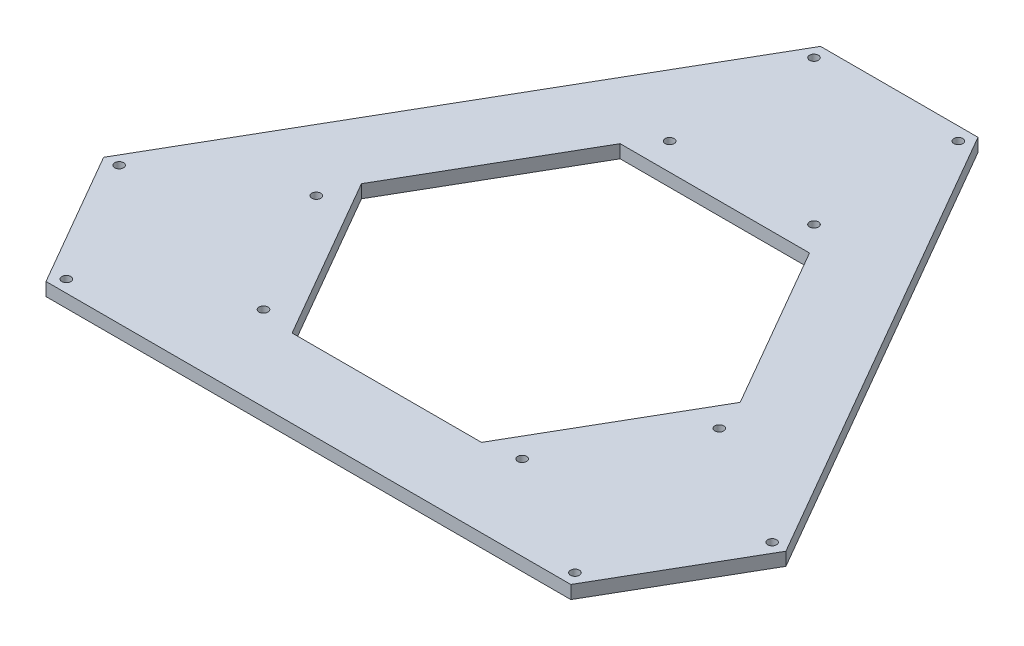
ISO-10303-21;
HEADER;
FILE_DESCRIPTION(('STEP AP214'),'2;1');
FILE_NAME('part.step','',(''),(''),'','','');
FILE_SCHEMA(('AUTOMOTIVE_DESIGN { 1 0 10303 214 1 1 1 1 }'));
ENDSEC;
DATA;
#1=APPLICATION_CONTEXT('core data for automotive mechanical design processes');
#2=APPLICATION_PROTOCOL_DEFINITION('international standard','automotive_design',2000,#1);
#3=PRODUCT_CONTEXT('',#1,'mechanical');
#4=PRODUCT('Part','Part','',(#3));
#5=PRODUCT_RELATED_PRODUCT_CATEGORY('part','',(#4));
#6=PRODUCT_DEFINITION_FORMATION('','',#4);
#7=PRODUCT_DEFINITION_CONTEXT('part definition',#1,'design');
#8=PRODUCT_DEFINITION('design','',#6,#7);
#9=PRODUCT_DEFINITION_SHAPE('','',#8);
#10=(LENGTH_UNIT() NAMED_UNIT(*) SI_UNIT(.MILLI.,.METRE.));
#11=(NAMED_UNIT(*) PLANE_ANGLE_UNIT() SI_UNIT($,.RADIAN.));
#12=(NAMED_UNIT(*) SI_UNIT($,.STERADIAN.) SOLID_ANGLE_UNIT());
#13=UNCERTAINTY_MEASURE_WITH_UNIT(LENGTH_MEASURE(1.E-05),#10,'distance_accuracy_value','');
#14=(GEOMETRIC_REPRESENTATION_CONTEXT(3) GLOBAL_UNCERTAINTY_ASSIGNED_CONTEXT((#13)) GLOBAL_UNIT_ASSIGNED_CONTEXT((#10,
#11,#12)) REPRESENTATION_CONTEXT('',''));
#15=CARTESIAN_POINT('',(0.,0.,0.));
#16=DIRECTION('',(0.,0.,1.));
#17=DIRECTION('',(1.,0.,0.));
#18=AXIS2_PLACEMENT_3D('',#15,#16,#17);
#19=CARTESIAN_POINT('',(0.,5.,0.));
#20=DIRECTION('',(0.,-1.,0.));
#21=DIRECTION('',(0.,0.,-1.));
#22=AXIS2_PLACEMENT_3D('',#19,#20,#21);
#23=PLANE('',#22);
#24=CARTESIAN_POINT('',(-124.419872981078,5.,40.0795823527349));
#25=DIRECTION('',(0.,1.,0.));
#26=DIRECTION('',(0.,0.,-1.));
#27=AXIS2_PLACEMENT_3D('',#24,#25,#26);
#28=CIRCLE('',#27,1.7);
#29=CARTESIAN_POINT('',(-124.419872981078,5.,38.3795823527349));
#30=VERTEX_POINT('',#29);
#31=EDGE_CURVE('E366',#30,#30,#28,.T.);
#32=ORIENTED_EDGE('',*,*,#31,.F.);
#33=EDGE_LOOP('',(#32));
#34=FACE_BOUND('',#33,.T.);
#35=CARTESIAN_POINT('',(-96.9198729810777,5.,87.710979560879));
#36=DIRECTION('',(0.,1.,0.));
#37=DIRECTION('',(0.,0.,1.));
#38=AXIS2_PLACEMENT_3D('',#35,#36,#37);
#39=CIRCLE('',#38,1.7);
#40=CARTESIAN_POINT('',(-96.9198729810777,5.,89.410979560879));
#41=VERTEX_POINT('',#40);
#42=EDGE_CURVE('E378',#41,#41,#39,.T.);
#43=ORIENTED_EDGE('',*,*,#42,.F.);
#44=EDGE_LOOP('',(#43));
#45=FACE_BOUND('',#44,.T.);
#46=CARTESIAN_POINT('',(96.9198729810778,5.,87.710979560879));
#47=DIRECTION('',(0.,1.,0.));
#48=DIRECTION('',(0.,0.,-1.));
#49=AXIS2_PLACEMENT_3D('',#46,#47,#48);
#50=CIRCLE('',#49,1.70000000000001);
#51=CARTESIAN_POINT('',(96.9198729810778,5.,86.010979560879));
#52=VERTEX_POINT('',#51);
#53=EDGE_CURVE('E390',#52,#52,#50,.T.);
#54=ORIENTED_EDGE('',*,*,#53,.F.);
#55=EDGE_LOOP('',(#54));
#56=FACE_BOUND('',#55,.T.);
#57=CARTESIAN_POINT('',(124.419872981078,5.,40.0795823527348));
#58=DIRECTION('',(0.,1.,0.));
#59=DIRECTION('',(0.,0.,1.));
#60=AXIS2_PLACEMENT_3D('',#57,#58,#59);
#61=CIRCLE('',#60,1.7);
#62=CARTESIAN_POINT('',(124.419872981078,5.,41.7795823527348));
#63=VERTEX_POINT('',#62);
#64=EDGE_CURVE('E156',#63,#63,#61,.T.);
#65=ORIENTED_EDGE('',*,*,#64,.F.);
#66=EDGE_LOOP('',(#65));
#67=FACE_BOUND('',#66,.T.);
#68=CARTESIAN_POINT('',(27.5,5.,-72.7905619136139));
#69=DIRECTION('',(0.,1.,0.));
#70=DIRECTION('',(0.,0.,-1.));
#71=AXIS2_PLACEMENT_3D('',#68,#69,#70);
#72=CIRCLE('',#71,1.7);
#73=CARTESIAN_POINT('',(27.5,5.,-74.4905619136139));
#74=VERTEX_POINT('',#73);
#75=EDGE_CURVE('E176',#74,#74,#72,.T.);
#76=ORIENTED_EDGE('',*,*,#75,.F.);
#77=EDGE_LOOP('',(#76));
#78=FACE_BOUND('',#77,.T.);
#79=CARTESIAN_POINT('',(-27.5,5.,-72.7905619136139));
#80=DIRECTION('',(0.,1.,0.));
#81=DIRECTION('',(0.,0.,1.));
#82=AXIS2_PLACEMENT_3D('',#79,#80,#81);
#83=CIRCLE('',#82,1.7);
#84=CARTESIAN_POINT('',(-27.5,5.,-71.0905619136139));
#85=VERTEX_POINT('',#84);
#86=EDGE_CURVE('E188',#85,#85,#83,.T.);
#87=ORIENTED_EDGE('',*,*,#86,.F.);
#88=EDGE_LOOP('',(#87));
#89=FACE_BOUND('',#88,.T.);
#90=DIRECTION('',(-0.5,0.,0.866025403784439));
#91=VECTOR('',#90,1.);
#92=CARTESIAN_POINT('',(-130.,5.,40.4145188432739));
#93=LINE('',#92,#91);
#94=CARTESIAN_POINT('',(-30.,5.,-132.790561913614));
#95=VERTEX_POINT('',#94);
#96=CARTESIAN_POINT('',(-130.,5.,40.4145188432739));
#97=VERTEX_POINT('',#96);
#98=EDGE_CURVE('E200',#95,#97,#93,.T.);
#99=ORIENTED_EDGE('',*,*,#98,.T.);
#100=DIRECTION('',(0.5,0.,0.866025403784439));
#101=VECTOR('',#100,1.);
#102=CARTESIAN_POINT('',(-100.,5.,92.3760430703402));
#103=LINE('',#102,#101);
#104=CARTESIAN_POINT('',(-100.,5.,92.3760430703402));
#105=VERTEX_POINT('',#104);
#106=EDGE_CURVE('E203',#97,#105,#103,.T.);
#107=ORIENTED_EDGE('',*,*,#106,.T.);
#108=DIRECTION('',(1.,0.,0.));
#109=VECTOR('',#108,1.);
#110=CARTESIAN_POINT('',(100.,5.,92.3760430703402));
#111=LINE('',#110,#109);
#112=CARTESIAN_POINT('',(100.,5.,92.3760430703402));
#113=VERTEX_POINT('',#112);
#114=EDGE_CURVE('E206',#105,#113,#111,.T.);
#115=ORIENTED_EDGE('',*,*,#114,.T.);
#116=DIRECTION('',(0.5,0.,-0.866025403784439));
#117=VECTOR('',#116,1.);
#118=CARTESIAN_POINT('',(130.,5.,40.4145188432739));
#119=LINE('',#118,#117);
#120=CARTESIAN_POINT('',(130.,5.,40.4145188432739));
#121=VERTEX_POINT('',#120);
#122=EDGE_CURVE('E208',#113,#121,#119,.T.);
#123=ORIENTED_EDGE('',*,*,#122,.T.);
#124=DIRECTION('',(-0.5,0.,-0.866025403784439));
#125=VECTOR('',#124,1.);
#126=CARTESIAN_POINT('',(30.,5.,-132.790561913614));
#127=LINE('',#126,#125);
#128=CARTESIAN_POINT('',(30.,5.,-132.790561913614));
#129=VERTEX_POINT('',#128);
#130=EDGE_CURVE('E210',#121,#129,#127,.T.);
#131=ORIENTED_EDGE('',*,*,#130,.T.);
#132=DIRECTION('',(-1.,0.,0.));
#133=VECTOR('',#132,1.);
#134=CARTESIAN_POINT('',(-30.,5.,-132.790561913614));
#135=LINE('',#134,#133);
#136=EDGE_CURVE('E212',#129,#95,#135,.T.);
#137=ORIENTED_EDGE('',*,*,#136,.T.);
#138=EDGE_LOOP('',(#99,#107,#115,#123,#131,#137));
#139=FACE_BOUND('',#138,.T.);
#140=CARTESIAN_POINT('',(-27.5,5.,-127.790561913614));
#141=DIRECTION('',(0.,1.,0.));
#142=DIRECTION('',(0.,0.,1.));
#143=AXIS2_PLACEMENT_3D('',#140,#141,#142);
#144=CIRCLE('',#143,1.7);
#145=CARTESIAN_POINT('',(-27.5,5.,-126.090561913614));
#146=VERTEX_POINT('',#145);
#147=EDGE_CURVE('E194',#146,#146,#144,.T.);
#148=ORIENTED_EDGE('',*,*,#147,.F.);
#149=EDGE_LOOP('',(#148));
#150=FACE_BOUND('',#149,.T.);
#151=CARTESIAN_POINT('',(27.5,5.,-127.790561913614));
#152=DIRECTION('',(0.,1.,0.));
#153=DIRECTION('',(0.,0.,-1.));
#154=AXIS2_PLACEMENT_3D('',#151,#152,#153);
#155=CIRCLE('',#154,1.7);
#156=CARTESIAN_POINT('',(27.5,5.,-129.490561913614));
#157=VERTEX_POINT('',#156);
#158=EDGE_CURVE('E182',#157,#157,#155,.T.);
#159=ORIENTED_EDGE('',*,*,#158,.F.);
#160=EDGE_LOOP('',(#159));
#161=FACE_BOUND('',#160,.T.);
#162=DIRECTION('',(-0.5,0.,0.866025403784439));
#163=VECTOR('',#162,1.);
#164=CARTESIAN_POINT('',(-36.0843918243516,5.,-62.5));
#165=LINE('',#164,#163);
#166=CARTESIAN_POINT('',(-36.0843918243516,5.,-62.5));
#167=VERTEX_POINT('',#166);
#168=CARTESIAN_POINT('',(-72.1687836487032,5.,0.));
#169=VERTEX_POINT('',#168);
#170=EDGE_CURVE('E122',#167,#169,#165,.T.);
#171=ORIENTED_EDGE('',*,*,#170,.F.);
#172=DIRECTION('',(-1.,0.,0.));
#173=VECTOR('',#172,1.);
#174=CARTESIAN_POINT('',(36.0843918243516,5.,-62.5));
#175=LINE('',#174,#173);
#176=CARTESIAN_POINT('',(36.0843918243516,5.,-62.5));
#177=VERTEX_POINT('',#176);
#178=EDGE_CURVE('E153',#177,#167,#175,.T.);
#179=ORIENTED_EDGE('',*,*,#178,.F.);
#180=DIRECTION('',(-0.5,0.,-0.866025403784439));
#181=VECTOR('',#180,1.);
#182=CARTESIAN_POINT('',(72.1687836487032,5.,0.));
#183=LINE('',#182,#181);
#184=CARTESIAN_POINT('',(72.1687836487032,5.,0.));
#185=VERTEX_POINT('',#184);
#186=EDGE_CURVE('E151',#185,#177,#183,.T.);
#187=ORIENTED_EDGE('',*,*,#186,.F.);
#188=DIRECTION('',(0.5,0.,-0.866025403784439));
#189=VECTOR('',#188,1.);
#190=CARTESIAN_POINT('',(36.0843918243516,5.,62.5));
#191=LINE('',#190,#189);
#192=CARTESIAN_POINT('',(36.0843918243516,5.,62.5));
#193=VERTEX_POINT('',#192);
#194=EDGE_CURVE('E146',#193,#185,#191,.T.);
#195=ORIENTED_EDGE('',*,*,#194,.F.);
#196=DIRECTION('',(1.,0.,0.));
#197=VECTOR('',#196,1.);
#198=CARTESIAN_POINT('',(-36.0843918243516,5.,62.5));
#199=LINE('',#198,#197);
#200=CARTESIAN_POINT('',(-36.0843918243516,5.,62.5));
#201=VERTEX_POINT('',#200);
#202=EDGE_CURVE('E144',#201,#193,#199,.T.);
#203=ORIENTED_EDGE('',*,*,#202,.F.);
#204=DIRECTION('',(0.5,0.,0.866025403784439));
#205=VECTOR('',#204,1.);
#206=CARTESIAN_POINT('',(-72.1687836487032,5.,0.));
#207=LINE('',#206,#205);
#208=EDGE_CURVE('E130',#169,#201,#207,.T.);
#209=ORIENTED_EDGE('',*,*,#208,.F.);
#210=EDGE_LOOP('',(#171,#179,#187,#195,#203,#209));
#211=FACE_BOUND('',#210,.T.);
#212=CARTESIAN_POINT('',(76.7884757729337,5.,12.5795823527349));
#213=DIRECTION('',(0.,1.,0.));
#214=DIRECTION('',(0.,0.,1.));
#215=AXIS2_PLACEMENT_3D('',#212,#213,#214);
#216=CIRCLE('',#215,1.7);
#217=CARTESIAN_POINT('',(76.7884757729337,5.,14.2795823527349));
#218=VERTEX_POINT('',#217);
#219=EDGE_CURVE('E396',#218,#218,#216,.T.);
#220=ORIENTED_EDGE('',*,*,#219,.F.);
#221=EDGE_LOOP('',(#220));
#222=FACE_BOUND('',#221,.T.);
#223=CARTESIAN_POINT('',(49.2884757729337,5.,60.210979560879));
#224=DIRECTION('',(0.,1.,0.));
#225=DIRECTION('',(0.,0.,-1.));
#226=AXIS2_PLACEMENT_3D('',#223,#224,#225);
#227=CIRCLE('',#226,1.7);
#228=CARTESIAN_POINT('',(49.2884757729337,5.,58.510979560879));
#229=VERTEX_POINT('',#228);
#230=EDGE_CURVE('E384',#229,#229,#227,.T.);
#231=ORIENTED_EDGE('',*,*,#230,.F.);
#232=EDGE_LOOP('',(#231));
#233=FACE_BOUND('',#232,.T.);
#234=CARTESIAN_POINT('',(-49.2884757729336,5.,60.210979560879));
#235=DIRECTION('',(0.,1.,0.));
#236=DIRECTION('',(0.,0.,1.));
#237=AXIS2_PLACEMENT_3D('',#234,#235,#236);
#238=CIRCLE('',#237,1.7);
#239=CARTESIAN_POINT('',(-49.2884757729336,5.,61.910979560879));
#240=VERTEX_POINT('',#239);
#241=EDGE_CURVE('E372',#240,#240,#238,.T.);
#242=ORIENTED_EDGE('',*,*,#241,.F.);
#243=EDGE_LOOP('',(#242));
#244=FACE_BOUND('',#243,.T.);
#245=CARTESIAN_POINT('',(-76.7884757729336,5.,12.5795823527349));
#246=DIRECTION('',(0.,1.,0.));
#247=DIRECTION('',(0.,0.,-1.));
#248=AXIS2_PLACEMENT_3D('',#245,#246,#247);
#249=CIRCLE('',#248,1.70000000000001);
#250=CARTESIAN_POINT('',(-76.7884757729336,5.,10.8795823527349));
#251=VERTEX_POINT('',#250);
#252=EDGE_CURVE('E357',#251,#251,#249,.T.);
#253=ORIENTED_EDGE('',*,*,#252,.F.);
#254=EDGE_LOOP('',(#253));
#255=FACE_BOUND('',#254,.T.);
#256=ADVANCED_FACE('F33',(#34,#45,#56,#67,#78,#89,#139,#150,#161,#211,#222,#233,#244,#255),#23,.F.);
#257=CARTESIAN_POINT('',(0.,0.,0.));
#258=DIRECTION('',(0.,-1.,0.));
#259=DIRECTION('',(0.,0.,-1.));
#260=AXIS2_PLACEMENT_3D('',#257,#258,#259);
#261=PLANE('',#260);
#262=CARTESIAN_POINT('',(-124.419872981078,0.,40.0795823527349));
#263=DIRECTION('',(0.,1.,0.));
#264=DIRECTION('',(0.,0.,-1.));
#265=AXIS2_PLACEMENT_3D('',#262,#263,#264);
#266=CIRCLE('',#265,1.7);
#267=CARTESIAN_POINT('',(-124.419872981078,0.,38.3795823527349));
#268=VERTEX_POINT('',#267);
#269=EDGE_CURVE('E363',#268,#268,#266,.T.);
#270=ORIENTED_EDGE('',*,*,#269,.T.);
#271=EDGE_LOOP('',(#270));
#272=FACE_BOUND('',#271,.T.);
#273=CARTESIAN_POINT('',(-96.9198729810777,0.,87.710979560879));
#274=DIRECTION('',(0.,1.,0.));
#275=DIRECTION('',(0.,0.,1.));
#276=AXIS2_PLACEMENT_3D('',#273,#274,#275);
#277=CIRCLE('',#276,1.7);
#278=CARTESIAN_POINT('',(-96.9198729810777,0.,89.410979560879));
#279=VERTEX_POINT('',#278);
#280=EDGE_CURVE('E375',#279,#279,#277,.T.);
#281=ORIENTED_EDGE('',*,*,#280,.T.);
#282=EDGE_LOOP('',(#281));
#283=FACE_BOUND('',#282,.T.);
#284=CARTESIAN_POINT('',(96.9198729810778,0.,87.710979560879));
#285=DIRECTION('',(0.,1.,0.));
#286=DIRECTION('',(0.,0.,-1.));
#287=AXIS2_PLACEMENT_3D('',#284,#285,#286);
#288=CIRCLE('',#287,1.70000000000001);
#289=CARTESIAN_POINT('',(96.9198729810778,0.,86.010979560879));
#290=VERTEX_POINT('',#289);
#291=EDGE_CURVE('E387',#290,#290,#288,.T.);
#292=ORIENTED_EDGE('',*,*,#291,.T.);
#293=EDGE_LOOP('',(#292));
#294=FACE_BOUND('',#293,.T.);
#295=CARTESIAN_POINT('',(124.419872981078,0.,40.0795823527348));
#296=DIRECTION('',(0.,1.,0.));
#297=DIRECTION('',(0.,0.,1.));
#298=AXIS2_PLACEMENT_3D('',#295,#296,#297);
#299=CIRCLE('',#298,1.7);
#300=CARTESIAN_POINT('',(124.419872981078,0.,41.7795823527348));
#301=VERTEX_POINT('',#300);
#302=EDGE_CURVE('E399',#301,#301,#299,.T.);
#303=ORIENTED_EDGE('',*,*,#302,.T.);
#304=EDGE_LOOP('',(#303));
#305=FACE_BOUND('',#304,.T.);
#306=CARTESIAN_POINT('',(27.5,0.,-72.7905619136139));
#307=DIRECTION('',(0.,1.,0.));
#308=DIRECTION('',(0.,0.,-1.));
#309=AXIS2_PLACEMENT_3D('',#306,#307,#308);
#310=CIRCLE('',#309,1.7);
#311=CARTESIAN_POINT('',(27.5,0.,-74.4905619136139));
#312=VERTEX_POINT('',#311);
#313=EDGE_CURVE('E138',#312,#312,#310,.T.);
#314=ORIENTED_EDGE('',*,*,#313,.T.);
#315=EDGE_LOOP('',(#314));
#316=FACE_BOUND('',#315,.T.);
#317=CARTESIAN_POINT('',(-27.5,0.,-72.7905619136139));
#318=DIRECTION('',(0.,1.,0.));
#319=DIRECTION('',(0.,0.,1.));
#320=AXIS2_PLACEMENT_3D('',#317,#318,#319);
#321=CIRCLE('',#320,1.7);
#322=CARTESIAN_POINT('',(-27.5,0.,-71.0905619136139));
#323=VERTEX_POINT('',#322);
#324=EDGE_CURVE('E185',#323,#323,#321,.T.);
#325=ORIENTED_EDGE('',*,*,#324,.T.);
#326=EDGE_LOOP('',(#325));
#327=FACE_BOUND('',#326,.T.);
#328=DIRECTION('',(-0.5,0.,0.866025403784439));
#329=VECTOR('',#328,1.);
#330=CARTESIAN_POINT('',(-130.,0.,40.4145188432739));
#331=LINE('',#330,#329);
#332=CARTESIAN_POINT('',(-30.,0.,-132.790561913614));
#333=VERTEX_POINT('',#332);
#334=CARTESIAN_POINT('',(-130.,0.,40.4145188432739));
#335=VERTEX_POINT('',#334);
#336=EDGE_CURVE('E197',#333,#335,#331,.T.);
#337=ORIENTED_EDGE('',*,*,#336,.F.);
#338=DIRECTION('',(-1.,0.,0.));
#339=VECTOR('',#338,1.);
#340=CARTESIAN_POINT('',(-30.,0.,-132.790561913614));
#341=LINE('',#340,#339);
#342=CARTESIAN_POINT('',(30.,0.,-132.790561913614));
#343=VERTEX_POINT('',#342);
#344=EDGE_CURVE('E204',#343,#333,#341,.T.);
#345=ORIENTED_EDGE('',*,*,#344,.F.);
#346=DIRECTION('',(-0.5,0.,-0.866025403784439));
#347=VECTOR('',#346,1.);
#348=CARTESIAN_POINT('',(30.,0.,-132.790561913614));
#349=LINE('',#348,#347);
#350=CARTESIAN_POINT('',(130.,0.,40.4145188432739));
#351=VERTEX_POINT('',#350);
#352=EDGE_CURVE('E223',#351,#343,#349,.T.);
#353=ORIENTED_EDGE('',*,*,#352,.F.);
#354=DIRECTION('',(0.5,0.,-0.866025403784439));
#355=VECTOR('',#354,1.);
#356=CARTESIAN_POINT('',(130.,0.,40.4145188432739));
#357=LINE('',#356,#355);
#358=CARTESIAN_POINT('',(100.,0.,92.3760430703402));
#359=VERTEX_POINT('',#358);
#360=EDGE_CURVE('E221',#359,#351,#357,.T.);
#361=ORIENTED_EDGE('',*,*,#360,.F.);
#362=DIRECTION('',(1.,0.,0.));
#363=VECTOR('',#362,1.);
#364=CARTESIAN_POINT('',(100.,0.,92.3760430703402));
#365=LINE('',#364,#363);
#366=CARTESIAN_POINT('',(-100.,0.,92.3760430703402));
#367=VERTEX_POINT('',#366);
#368=EDGE_CURVE('E219',#367,#359,#365,.T.);
#369=ORIENTED_EDGE('',*,*,#368,.F.);
#370=DIRECTION('',(0.5,0.,0.866025403784439));
#371=VECTOR('',#370,1.);
#372=CARTESIAN_POINT('',(-100.,0.,92.3760430703402));
#373=LINE('',#372,#371);
#374=EDGE_CURVE('E217',#335,#367,#373,.T.);
#375=ORIENTED_EDGE('',*,*,#374,.F.);
#376=EDGE_LOOP('',(#337,#345,#353,#361,#369,#375));
#377=FACE_BOUND('',#376,.T.);
#378=CARTESIAN_POINT('',(-27.5,0.,-127.790561913614));
#379=DIRECTION('',(0.,1.,0.));
#380=DIRECTION('',(0.,0.,1.));
#381=AXIS2_PLACEMENT_3D('',#378,#379,#380);
#382=CIRCLE('',#381,1.7);
#383=CARTESIAN_POINT('',(-27.5,0.,-126.090561913614));
#384=VERTEX_POINT('',#383);
#385=EDGE_CURVE('E191',#384,#384,#382,.T.);
#386=ORIENTED_EDGE('',*,*,#385,.T.);
#387=EDGE_LOOP('',(#386));
#388=FACE_BOUND('',#387,.T.);
#389=CARTESIAN_POINT('',(27.5,0.,-127.790561913614));
#390=DIRECTION('',(0.,1.,0.));
#391=DIRECTION('',(0.,0.,-1.));
#392=AXIS2_PLACEMENT_3D('',#389,#390,#391);
#393=CIRCLE('',#392,1.7);
#394=CARTESIAN_POINT('',(27.5,0.,-129.490561913614));
#395=VERTEX_POINT('',#394);
#396=EDGE_CURVE('E179',#395,#395,#393,.T.);
#397=ORIENTED_EDGE('',*,*,#396,.T.);
#398=EDGE_LOOP('',(#397));
#399=FACE_BOUND('',#398,.T.);
#400=DIRECTION('',(-1.,0.,0.));
#401=VECTOR('',#400,1.);
#402=CARTESIAN_POINT('',(36.0843918243516,0.,-62.5));
#403=LINE('',#402,#401);
#404=CARTESIAN_POINT('',(36.0843918243516,0.,-62.5));
#405=VERTEX_POINT('',#404);
#406=CARTESIAN_POINT('',(-36.0843918243516,0.,-62.5));
#407=VERTEX_POINT('',#406);
#408=EDGE_CURVE('E131',#405,#407,#403,.T.);
#409=ORIENTED_EDGE('',*,*,#408,.T.);
#410=DIRECTION('',(-0.5,0.,0.866025403784439));
#411=VECTOR('',#410,1.);
#412=CARTESIAN_POINT('',(-36.0843918243516,0.,-62.5));
#413=LINE('',#412,#411);
#414=CARTESIAN_POINT('',(-72.1687836487032,0.,0.));
#415=VERTEX_POINT('',#414);
#416=EDGE_CURVE('E56',#407,#415,#413,.T.);
#417=ORIENTED_EDGE('',*,*,#416,.T.);
#418=DIRECTION('',(0.5,0.,0.866025403784439));
#419=VECTOR('',#418,1.);
#420=CARTESIAN_POINT('',(-72.1687836487032,0.,0.));
#421=LINE('',#420,#419);
#422=CARTESIAN_POINT('',(-36.0843918243516,0.,62.5));
#423=VERTEX_POINT('',#422);
#424=EDGE_CURVE('E137',#415,#423,#421,.T.);
#425=ORIENTED_EDGE('',*,*,#424,.T.);
#426=DIRECTION('',(1.,0.,0.));
#427=VECTOR('',#426,1.);
#428=CARTESIAN_POINT('',(-36.0843918243516,0.,62.5));
#429=LINE('',#428,#427);
#430=CARTESIAN_POINT('',(36.0843918243516,0.,62.5));
#431=VERTEX_POINT('',#430);
#432=EDGE_CURVE('E158',#423,#431,#429,.T.);
#433=ORIENTED_EDGE('',*,*,#432,.T.);
#434=DIRECTION('',(0.5,0.,-0.866025403784439));
#435=VECTOR('',#434,1.);
#436=CARTESIAN_POINT('',(36.0843918243516,0.,62.5));
#437=LINE('',#436,#435);
#438=CARTESIAN_POINT('',(72.1687836487032,0.,0.));
#439=VERTEX_POINT('',#438);
#440=EDGE_CURVE('E161',#431,#439,#437,.T.);
#441=ORIENTED_EDGE('',*,*,#440,.T.);
#442=DIRECTION('',(-0.5,0.,-0.866025403784439));
#443=VECTOR('',#442,1.);
#444=CARTESIAN_POINT('',(72.1687836487032,0.,0.));
#445=LINE('',#444,#443);
#446=EDGE_CURVE('E164',#439,#405,#445,.T.);
#447=ORIENTED_EDGE('',*,*,#446,.T.);
#448=EDGE_LOOP('',(#409,#417,#425,#433,#441,#447));
#449=FACE_BOUND('',#448,.T.);
#450=CARTESIAN_POINT('',(76.7884757729337,0.,12.5795823527349));
#451=DIRECTION('',(0.,1.,0.));
#452=DIRECTION('',(0.,0.,1.));
#453=AXIS2_PLACEMENT_3D('',#450,#451,#452);
#454=CIRCLE('',#453,1.7);
#455=CARTESIAN_POINT('',(76.7884757729337,0.,14.2795823527349));
#456=VERTEX_POINT('',#455);
#457=EDGE_CURVE('E393',#456,#456,#454,.T.);
#458=ORIENTED_EDGE('',*,*,#457,.T.);
#459=EDGE_LOOP('',(#458));
#460=FACE_BOUND('',#459,.T.);
#461=CARTESIAN_POINT('',(49.2884757729337,0.,60.210979560879));
#462=DIRECTION('',(0.,1.,0.));
#463=DIRECTION('',(0.,0.,-1.));
#464=AXIS2_PLACEMENT_3D('',#461,#462,#463);
#465=CIRCLE('',#464,1.7);
#466=CARTESIAN_POINT('',(49.2884757729337,0.,58.510979560879));
#467=VERTEX_POINT('',#466);
#468=EDGE_CURVE('E381',#467,#467,#465,.T.);
#469=ORIENTED_EDGE('',*,*,#468,.T.);
#470=EDGE_LOOP('',(#469));
#471=FACE_BOUND('',#470,.T.);
#472=CARTESIAN_POINT('',(-49.2884757729336,0.,60.210979560879));
#473=DIRECTION('',(0.,1.,0.));
#474=DIRECTION('',(0.,0.,1.));
#475=AXIS2_PLACEMENT_3D('',#472,#473,#474);
#476=CIRCLE('',#475,1.7);
#477=CARTESIAN_POINT('',(-49.2884757729336,0.,61.910979560879));
#478=VERTEX_POINT('',#477);
#479=EDGE_CURVE('E369',#478,#478,#476,.T.);
#480=ORIENTED_EDGE('',*,*,#479,.T.);
#481=EDGE_LOOP('',(#480));
#482=FACE_BOUND('',#481,.T.);
#483=CARTESIAN_POINT('',(-76.7884757729336,0.,12.5795823527349));
#484=DIRECTION('',(0.,1.,0.));
#485=DIRECTION('',(0.,0.,-1.));
#486=AXIS2_PLACEMENT_3D('',#483,#484,#485);
#487=CIRCLE('',#486,1.70000000000001);
#488=CARTESIAN_POINT('',(-76.7884757729336,0.,10.8795823527349));
#489=VERTEX_POINT('',#488);
#490=EDGE_CURVE('E360',#489,#489,#487,.T.);
#491=ORIENTED_EDGE('',*,*,#490,.T.);
#492=EDGE_LOOP('',(#491));
#493=FACE_BOUND('',#492,.T.);
#494=ADVANCED_FACE('F247',(#272,#283,#294,#305,#316,#327,#377,#388,#399,#449,#460,#471,#482,
#493),#261,.T.);
#495=CARTESIAN_POINT('',(-130.,5.,40.4145188432739));
#496=DIRECTION('',(0.866025403784439,0.,0.5));
#497=DIRECTION('',(0.5,0.,-0.866025403784439));
#498=AXIS2_PLACEMENT_3D('',#495,#496,#497);
#499=PLANE('',#498);
#500=ORIENTED_EDGE('',*,*,#336,.T.);
#501=DIRECTION('',(0.,-1.,0.));
#502=VECTOR('',#501,1.);
#503=CARTESIAN_POINT('',(-130.,5.,40.4145188432739));
#504=LINE('',#503,#502);
#505=EDGE_CURVE('E11',#97,#335,#504,.T.);
#506=ORIENTED_EDGE('',*,*,#505,.F.);
#507=ORIENTED_EDGE('',*,*,#98,.F.);
#508=DIRECTION('',(0.,-1.,0.));
#509=VECTOR('',#508,1.);
#510=CARTESIAN_POINT('',(-30.,5.,-132.790561913614));
#511=LINE('',#510,#509);
#512=EDGE_CURVE('E214',#95,#333,#511,.T.);
#513=ORIENTED_EDGE('',*,*,#512,.T.);
#514=EDGE_LOOP('',(#500,#506,#507,#513));
#515=FACE_BOUND('',#514,.T.);
#516=ADVANCED_FACE('F35',(#515),#499,.F.);
#517=CARTESIAN_POINT('',(-100.,5.,92.3760430703402));
#518=DIRECTION('',(0.866025403784439,0.,-0.5));
#519=DIRECTION('',(-0.5,0.,-0.866025403784439));
#520=AXIS2_PLACEMENT_3D('',#517,#518,#519);
#521=PLANE('',#520);
#522=ORIENTED_EDGE('',*,*,#374,.T.);
#523=DIRECTION('',(0.,-1.,0.));
#524=VECTOR('',#523,1.);
#525=CARTESIAN_POINT('',(-100.,5.,92.3760430703402));
#526=LINE('',#525,#524);
#527=EDGE_CURVE('E41',#105,#367,#526,.T.);
#528=ORIENTED_EDGE('',*,*,#527,.F.);
#529=ORIENTED_EDGE('',*,*,#106,.F.);
#530=ORIENTED_EDGE('',*,*,#505,.T.);
#531=EDGE_LOOP('',(#522,#528,#529,#530));
#532=FACE_BOUND('',#531,.T.);
#533=ADVANCED_FACE('F265',(#532),#521,.F.);
#534=CARTESIAN_POINT('',(100.,5.,92.3760430703402));
#535=DIRECTION('',(0.,0.,-1.));
#536=DIRECTION('',(-1.,0.,0.));
#537=AXIS2_PLACEMENT_3D('',#534,#535,#536);
#538=PLANE('',#537);
#539=ORIENTED_EDGE('',*,*,#368,.T.);
#540=DIRECTION('',(0.,-1.,0.));
#541=VECTOR('',#540,1.);
#542=CARTESIAN_POINT('',(100.,5.,92.3760430703402));
#543=LINE('',#542,#541);
#544=EDGE_CURVE('E234',#113,#359,#543,.T.);
#545=ORIENTED_EDGE('',*,*,#544,.F.);
#546=ORIENTED_EDGE('',*,*,#114,.F.);
#547=ORIENTED_EDGE('',*,*,#527,.T.);
#548=EDGE_LOOP('',(#539,#545,#546,#547));
#549=FACE_BOUND('',#548,.T.);
#550=ADVANCED_FACE('F241',(#549),#538,.F.);
#551=CARTESIAN_POINT('',(130.,5.,40.4145188432739));
#552=DIRECTION('',(-0.866025403784439,0.,-0.5));
#553=DIRECTION('',(-0.5,0.,0.866025403784439));
#554=AXIS2_PLACEMENT_3D('',#551,#552,#553);
#555=PLANE('',#554);
#556=ORIENTED_EDGE('',*,*,#360,.T.);
#557=DIRECTION('',(0.,-1.,0.));
#558=VECTOR('',#557,1.);
#559=CARTESIAN_POINT('',(130.,5.,40.4145188432739));
#560=LINE('',#559,#558);
#561=EDGE_CURVE('E231',#121,#351,#560,.T.);
#562=ORIENTED_EDGE('',*,*,#561,.F.);
#563=ORIENTED_EDGE('',*,*,#122,.F.);
#564=ORIENTED_EDGE('',*,*,#544,.T.);
#565=EDGE_LOOP('',(#556,#562,#563,#564));
#566=FACE_BOUND('',#565,.T.);
#567=ADVANCED_FACE('F253',(#566),#555,.F.);
#568=CARTESIAN_POINT('',(30.,5.,-132.790561913614));
#569=DIRECTION('',(-0.866025403784439,0.,0.5));
#570=DIRECTION('',(0.5,0.,0.866025403784439));
#571=AXIS2_PLACEMENT_3D('',#568,#569,#570);
#572=PLANE('',#571);
#573=ORIENTED_EDGE('',*,*,#352,.T.);
#574=DIRECTION('',(0.,-1.,0.));
#575=VECTOR('',#574,1.);
#576=CARTESIAN_POINT('',(30.,5.,-132.790561913614));
#577=LINE('',#576,#575);
#578=EDGE_CURVE('E228',#129,#343,#577,.T.);
#579=ORIENTED_EDGE('',*,*,#578,.F.);
#580=ORIENTED_EDGE('',*,*,#130,.F.);
#581=ORIENTED_EDGE('',*,*,#561,.T.);
#582=EDGE_LOOP('',(#573,#579,#580,#581));
#583=FACE_BOUND('',#582,.T.);
#584=ADVANCED_FACE('F257',(#583),#572,.F.);
#585=CARTESIAN_POINT('',(-30.,5.,-132.790561913614));
#586=DIRECTION('',(0.,0.,1.));
#587=DIRECTION('',(1.,0.,0.));
#588=AXIS2_PLACEMENT_3D('',#585,#586,#587);
#589=PLANE('',#588);
#590=ORIENTED_EDGE('',*,*,#344,.T.);
#591=ORIENTED_EDGE('',*,*,#512,.F.);
#592=ORIENTED_EDGE('',*,*,#136,.F.);
#593=ORIENTED_EDGE('',*,*,#578,.T.);
#594=EDGE_LOOP('',(#590,#591,#592,#593));
#595=FACE_BOUND('',#594,.T.);
#596=ADVANCED_FACE('F268',(#595),#589,.F.);
#597=CARTESIAN_POINT('',(-27.5,5.,-127.790561913614));
#598=DIRECTION('',(0.,-1.,0.));
#599=DIRECTION('',(0.,0.,-1.));
#600=AXIS2_PLACEMENT_3D('',#597,#598,#599);
#601=CYLINDRICAL_SURFACE('',#600,1.7);
#602=ORIENTED_EDGE('',*,*,#147,.T.);
#603=EDGE_LOOP('',(#602));
#604=FACE_BOUND('',#603,.T.);
#605=ORIENTED_EDGE('',*,*,#385,.F.);
#606=EDGE_LOOP('',(#605));
#607=FACE_BOUND('',#606,.T.);
#608=ADVANCED_FACE('F270',(#604,#607),#601,.F.);
#609=CARTESIAN_POINT('',(-27.5,5.,-72.7905619136139));
#610=DIRECTION('',(0.,-1.,0.));
#611=DIRECTION('',(0.,0.,-1.));
#612=AXIS2_PLACEMENT_3D('',#609,#610,#611);
#613=CYLINDRICAL_SURFACE('',#612,1.7);
#614=ORIENTED_EDGE('',*,*,#86,.T.);
#615=EDGE_LOOP('',(#614));
#616=FACE_BOUND('',#615,.T.);
#617=ORIENTED_EDGE('',*,*,#324,.F.);
#618=EDGE_LOOP('',(#617));
#619=FACE_BOUND('',#618,.T.);
#620=ADVANCED_FACE('F276',(#616,#619),#613,.F.);
#621=CARTESIAN_POINT('',(27.5,5.,-127.790561913614));
#622=DIRECTION('',(0.,-1.,0.));
#623=DIRECTION('',(0.,0.,-1.));
#624=AXIS2_PLACEMENT_3D('',#621,#622,#623);
#625=CYLINDRICAL_SURFACE('',#624,1.7);
#626=ORIENTED_EDGE('',*,*,#158,.T.);
#627=EDGE_LOOP('',(#626));
#628=FACE_BOUND('',#627,.T.);
#629=ORIENTED_EDGE('',*,*,#396,.F.);
#630=EDGE_LOOP('',(#629));
#631=FACE_BOUND('',#630,.T.);
#632=ADVANCED_FACE('F293',(#628,#631),#625,.F.);
#633=CARTESIAN_POINT('',(27.5,5.,-72.7905619136139));
#634=DIRECTION('',(0.,-1.,0.));
#635=DIRECTION('',(0.,0.,-1.));
#636=AXIS2_PLACEMENT_3D('',#633,#634,#635);
#637=CYLINDRICAL_SURFACE('',#636,1.7);
#638=ORIENTED_EDGE('',*,*,#75,.T.);
#639=EDGE_LOOP('',(#638));
#640=FACE_BOUND('',#639,.T.);
#641=ORIENTED_EDGE('',*,*,#313,.F.);
#642=EDGE_LOOP('',(#641));
#643=FACE_BOUND('',#642,.T.);
#644=ADVANCED_FACE('F297',(#640,#643),#637,.F.);
#645=CARTESIAN_POINT('',(-36.0843918243516,5.,-62.5));
#646=DIRECTION('',(0.866025403784439,0.,0.5));
#647=DIRECTION('',(0.5,0.,-0.866025403784439));
#648=AXIS2_PLACEMENT_3D('',#645,#646,#647);
#649=PLANE('',#648);
#650=ORIENTED_EDGE('',*,*,#416,.F.);
#651=DIRECTION('',(0.,-1.,0.));
#652=VECTOR('',#651,1.);
#653=CARTESIAN_POINT('',(-36.0843918243516,5.,-62.5));
#654=LINE('',#653,#652);
#655=EDGE_CURVE('E126',#167,#407,#654,.T.);
#656=ORIENTED_EDGE('',*,*,#655,.F.);
#657=ORIENTED_EDGE('',*,*,#170,.T.);
#658=DIRECTION('',(0.,-1.,0.));
#659=VECTOR('',#658,1.);
#660=CARTESIAN_POINT('',(-72.1687836487032,5.,0.));
#661=LINE('',#660,#659);
#662=EDGE_CURVE('E125',#169,#415,#661,.T.);
#663=ORIENTED_EDGE('',*,*,#662,.T.);
#664=EDGE_LOOP('',(#650,#656,#657,#663));
#665=FACE_BOUND('',#664,.T.);
#666=ADVANCED_FACE('F124',(#665),#649,.T.);
#667=CARTESIAN_POINT('',(-72.1687836487032,5.,0.));
#668=DIRECTION('',(0.866025403784439,0.,-0.5));
#669=DIRECTION('',(-0.5,0.,-0.866025403784439));
#670=AXIS2_PLACEMENT_3D('',#667,#668,#669);
#671=PLANE('',#670);
#672=ORIENTED_EDGE('',*,*,#424,.F.);
#673=ORIENTED_EDGE('',*,*,#662,.F.);
#674=ORIENTED_EDGE('',*,*,#208,.T.);
#675=DIRECTION('',(0.,-1.,0.));
#676=VECTOR('',#675,1.);
#677=CARTESIAN_POINT('',(-36.0843918243516,5.,62.5));
#678=LINE('',#677,#676);
#679=EDGE_CURVE('E139',#201,#423,#678,.T.);
#680=ORIENTED_EDGE('',*,*,#679,.T.);
#681=EDGE_LOOP('',(#672,#673,#674,#680));
#682=FACE_BOUND('',#681,.T.);
#683=ADVANCED_FACE('F134',(#682),#671,.T.);
#684=CARTESIAN_POINT('',(-36.0843918243516,5.,62.5));
#685=DIRECTION('',(0.,0.,-1.));
#686=DIRECTION('',(-1.,0.,0.));
#687=AXIS2_PLACEMENT_3D('',#684,#685,#686);
#688=PLANE('',#687);
#689=ORIENTED_EDGE('',*,*,#432,.F.);
#690=ORIENTED_EDGE('',*,*,#679,.F.);
#691=ORIENTED_EDGE('',*,*,#202,.T.);
#692=DIRECTION('',(0.,-1.,0.));
#693=VECTOR('',#692,1.);
#694=CARTESIAN_POINT('',(36.0843918243516,5.,62.5));
#695=LINE('',#694,#693);
#696=EDGE_CURVE('E173',#193,#431,#695,.T.);
#697=ORIENTED_EDGE('',*,*,#696,.T.);
#698=EDGE_LOOP('',(#689,#690,#691,#697));
#699=FACE_BOUND('',#698,.T.);
#700=ADVANCED_FACE('F306',(#699),#688,.T.);
#701=CARTESIAN_POINT('',(36.0843918243516,5.,62.5));
#702=DIRECTION('',(-0.866025403784439,0.,-0.5));
#703=DIRECTION('',(-0.5,0.,0.866025403784439));
#704=AXIS2_PLACEMENT_3D('',#701,#702,#703);
#705=PLANE('',#704);
#706=ORIENTED_EDGE('',*,*,#440,.F.);
#707=ORIENTED_EDGE('',*,*,#696,.F.);
#708=ORIENTED_EDGE('',*,*,#194,.T.);
#709=DIRECTION('',(0.,-1.,0.));
#710=VECTOR('',#709,1.);
#711=CARTESIAN_POINT('',(72.1687836487032,5.,0.));
#712=LINE('',#711,#710);
#713=EDGE_CURVE('E171',#185,#439,#712,.T.);
#714=ORIENTED_EDGE('',*,*,#713,.T.);
#715=EDGE_LOOP('',(#706,#707,#708,#714));
#716=FACE_BOUND('',#715,.T.);
#717=ADVANCED_FACE('F309',(#716),#705,.T.);
#718=CARTESIAN_POINT('',(72.1687836487032,5.,0.));
#719=DIRECTION('',(-0.866025403784439,0.,0.5));
#720=DIRECTION('',(0.5,0.,0.866025403784439));
#721=AXIS2_PLACEMENT_3D('',#718,#719,#720);
#722=PLANE('',#721);
#723=ORIENTED_EDGE('',*,*,#446,.F.);
#724=ORIENTED_EDGE('',*,*,#713,.F.);
#725=ORIENTED_EDGE('',*,*,#186,.T.);
#726=DIRECTION('',(0.,-1.,0.));
#727=VECTOR('',#726,1.);
#728=CARTESIAN_POINT('',(36.0843918243516,5.,-62.5));
#729=LINE('',#728,#727);
#730=EDGE_CURVE('E48',#177,#405,#729,.T.);
#731=ORIENTED_EDGE('',*,*,#730,.T.);
#732=EDGE_LOOP('',(#723,#724,#725,#731));
#733=FACE_BOUND('',#732,.T.);
#734=ADVANCED_FACE('F313',(#733),#722,.T.);
#735=CARTESIAN_POINT('',(36.0843918243516,5.,-62.5));
#736=DIRECTION('',(0.,0.,1.));
#737=DIRECTION('',(1.,0.,0.));
#738=AXIS2_PLACEMENT_3D('',#735,#736,#737);
#739=PLANE('',#738);
#740=ORIENTED_EDGE('',*,*,#408,.F.);
#741=ORIENTED_EDGE('',*,*,#730,.F.);
#742=ORIENTED_EDGE('',*,*,#178,.T.);
#743=ORIENTED_EDGE('',*,*,#655,.T.);
#744=EDGE_LOOP('',(#740,#741,#742,#743));
#745=FACE_BOUND('',#744,.T.);
#746=ADVANCED_FACE('F317',(#745),#739,.T.);
#747=CARTESIAN_POINT('',(124.419872981078,5.,40.0795823527348));
#748=DIRECTION('',(0.,-1.,0.));
#749=DIRECTION('',(0.,0.,-1.));
#750=AXIS2_PLACEMENT_3D('',#747,#748,#749);
#751=CYLINDRICAL_SURFACE('',#750,1.7);
#752=ORIENTED_EDGE('',*,*,#64,.T.);
#753=EDGE_LOOP('',(#752));
#754=FACE_BOUND('',#753,.T.);
#755=ORIENTED_EDGE('',*,*,#302,.F.);
#756=EDGE_LOOP('',(#755));
#757=FACE_BOUND('',#756,.T.);
#758=ADVANCED_FACE('F321',(#754,#757),#751,.F.);
#759=CARTESIAN_POINT('',(76.7884757729337,5.,12.5795823527349));
#760=DIRECTION('',(0.,-1.,0.));
#761=DIRECTION('',(0.,0.,-1.));
#762=AXIS2_PLACEMENT_3D('',#759,#760,#761);
#763=CYLINDRICAL_SURFACE('',#762,1.7);
#764=ORIENTED_EDGE('',*,*,#219,.T.);
#765=EDGE_LOOP('',(#764));
#766=FACE_BOUND('',#765,.T.);
#767=ORIENTED_EDGE('',*,*,#457,.F.);
#768=EDGE_LOOP('',(#767));
#769=FACE_BOUND('',#768,.T.);
#770=ADVANCED_FACE('F324',(#766,#769),#763,.F.);
#771=CARTESIAN_POINT('',(96.9198729810778,5.,87.710979560879));
#772=DIRECTION('',(0.,-1.,0.));
#773=DIRECTION('',(0.,0.,-1.));
#774=AXIS2_PLACEMENT_3D('',#771,#772,#773);
#775=CYLINDRICAL_SURFACE('',#774,1.70000000000001);
#776=ORIENTED_EDGE('',*,*,#53,.T.);
#777=EDGE_LOOP('',(#776));
#778=FACE_BOUND('',#777,.T.);
#779=ORIENTED_EDGE('',*,*,#291,.F.);
#780=EDGE_LOOP('',(#779));
#781=FACE_BOUND('',#780,.T.);
#782=ADVANCED_FACE('F328',(#778,#781),#775,.F.);
#783=CARTESIAN_POINT('',(49.2884757729337,5.,60.210979560879));
#784=DIRECTION('',(0.,-1.,0.));
#785=DIRECTION('',(0.,0.,-1.));
#786=AXIS2_PLACEMENT_3D('',#783,#784,#785);
#787=CYLINDRICAL_SURFACE('',#786,1.7);
#788=ORIENTED_EDGE('',*,*,#230,.T.);
#789=EDGE_LOOP('',(#788));
#790=FACE_BOUND('',#789,.T.);
#791=ORIENTED_EDGE('',*,*,#468,.F.);
#792=EDGE_LOOP('',(#791));
#793=FACE_BOUND('',#792,.T.);
#794=ADVANCED_FACE('F332',(#790,#793),#787,.F.);
#795=CARTESIAN_POINT('',(-96.9198729810777,5.,87.710979560879));
#796=DIRECTION('',(0.,-1.,0.));
#797=DIRECTION('',(0.,0.,-1.));
#798=AXIS2_PLACEMENT_3D('',#795,#796,#797);
#799=CYLINDRICAL_SURFACE('',#798,1.7);
#800=ORIENTED_EDGE('',*,*,#42,.T.);
#801=EDGE_LOOP('',(#800));
#802=FACE_BOUND('',#801,.T.);
#803=ORIENTED_EDGE('',*,*,#280,.F.);
#804=EDGE_LOOP('',(#803));
#805=FACE_BOUND('',#804,.T.);
#806=ADVANCED_FACE('F336',(#802,#805),#799,.F.);
#807=CARTESIAN_POINT('',(-49.2884757729336,5.,60.210979560879));
#808=DIRECTION('',(0.,-1.,0.));
#809=DIRECTION('',(0.,0.,-1.));
#810=AXIS2_PLACEMENT_3D('',#807,#808,#809);
#811=CYLINDRICAL_SURFACE('',#810,1.7);
#812=ORIENTED_EDGE('',*,*,#241,.T.);
#813=EDGE_LOOP('',(#812));
#814=FACE_BOUND('',#813,.T.);
#815=ORIENTED_EDGE('',*,*,#479,.F.);
#816=EDGE_LOOP('',(#815));
#817=FACE_BOUND('',#816,.T.);
#818=ADVANCED_FACE('F340',(#814,#817),#811,.F.);
#819=CARTESIAN_POINT('',(-124.419872981078,5.,40.0795823527349));
#820=DIRECTION('',(0.,-1.,0.));
#821=DIRECTION('',(0.,0.,-1.));
#822=AXIS2_PLACEMENT_3D('',#819,#820,#821);
#823=CYLINDRICAL_SURFACE('',#822,1.7);
#824=ORIENTED_EDGE('',*,*,#31,.T.);
#825=EDGE_LOOP('',(#824));
#826=FACE_BOUND('',#825,.T.);
#827=ORIENTED_EDGE('',*,*,#269,.F.);
#828=EDGE_LOOP('',(#827));
#829=FACE_BOUND('',#828,.T.);
#830=ADVANCED_FACE('F344',(#826,#829),#823,.F.);
#831=CARTESIAN_POINT('',(-76.7884757729336,5.,12.5795823527349));
#832=DIRECTION('',(0.,-1.,0.));
#833=DIRECTION('',(0.,0.,-1.));
#834=AXIS2_PLACEMENT_3D('',#831,#832,#833);
#835=CYLINDRICAL_SURFACE('',#834,1.70000000000001);
#836=ORIENTED_EDGE('',*,*,#252,.T.);
#837=EDGE_LOOP('',(#836));
#838=FACE_BOUND('',#837,.T.);
#839=ORIENTED_EDGE('',*,*,#490,.F.);
#840=EDGE_LOOP('',(#839));
#841=FACE_BOUND('',#840,.T.);
#842=ADVANCED_FACE('F348',(#838,#841),#835,.F.);
#843=CLOSED_SHELL('',(#256,#494,#516,#533,#550,#567,#584,#596,#608,#620,#632,#644,#666,#683,
#700,#717,#734,#746,#758,#770,#782,#794,#806,#818,#830,#842));
#844=MANIFOLD_SOLID_BREP('B2',#843);
#845=ADVANCED_BREP_SHAPE_REPRESENTATION('',(#18,#844),#14);
#846=SHAPE_DEFINITION_REPRESENTATION(#9,#845);
ENDSEC;
END-ISO-10303-21;
